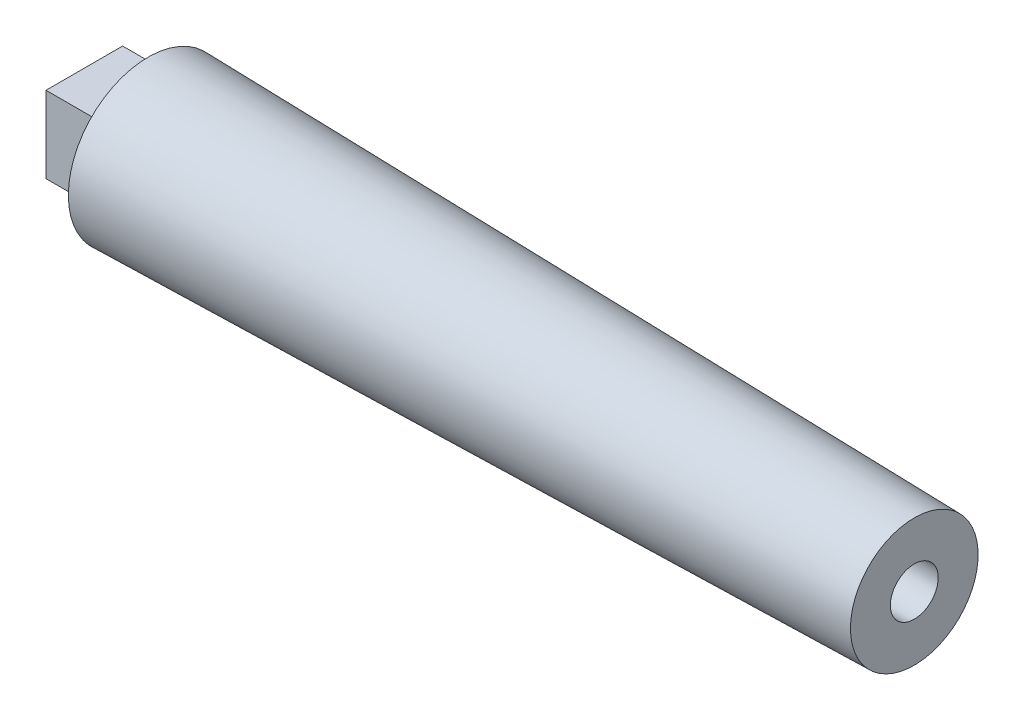
ISO-10303-21;
HEADER;
FILE_DESCRIPTION(('STEP AP214'),'2;1');
FILE_NAME('part.step','',(''),(''),'','','');
FILE_SCHEMA(('AUTOMOTIVE_DESIGN { 1 0 10303 214 1 1 1 1 }'));
ENDSEC;
DATA;
#1=APPLICATION_CONTEXT('core data for automotive mechanical design processes');
#2=APPLICATION_PROTOCOL_DEFINITION('international standard','automotive_design',2000,#1);
#3=PRODUCT_CONTEXT('',#1,'mechanical');
#4=PRODUCT('Part','Part','',(#3));
#5=PRODUCT_RELATED_PRODUCT_CATEGORY('part','',(#4));
#6=PRODUCT_DEFINITION_FORMATION('','',#4);
#7=PRODUCT_DEFINITION_CONTEXT('part definition',#1,'design');
#8=PRODUCT_DEFINITION('design','',#6,#7);
#9=PRODUCT_DEFINITION_SHAPE('','',#8);
#10=(LENGTH_UNIT() NAMED_UNIT(*) SI_UNIT(.MILLI.,.METRE.));
#11=(NAMED_UNIT(*) PLANE_ANGLE_UNIT() SI_UNIT($,.RADIAN.));
#12=(NAMED_UNIT(*) SI_UNIT($,.STERADIAN.) SOLID_ANGLE_UNIT());
#13=UNCERTAINTY_MEASURE_WITH_UNIT(LENGTH_MEASURE(1.E-05),#10,'distance_accuracy_value','');
#14=(GEOMETRIC_REPRESENTATION_CONTEXT(3) GLOBAL_UNCERTAINTY_ASSIGNED_CONTEXT((#13)) GLOBAL_UNIT_ASSIGNED_CONTEXT((#10,
#11,#12)) REPRESENTATION_CONTEXT('',''));
#15=CARTESIAN_POINT('',(0.,0.,0.));
#16=DIRECTION('',(0.,0.,1.));
#17=DIRECTION('',(1.,0.,0.));
#18=AXIS2_PLACEMENT_3D('',#15,#16,#17);
#19=CARTESIAN_POINT('',(0.,15.875,0.));
#20=DIRECTION('',(1.,0.,0.));
#21=DIRECTION('',(0.,0.,-1.));
#22=AXIS2_PLACEMENT_3D('',#19,#20,#21);
#23=PLANE('',#22);
#24=CARTESIAN_POINT('',(0.,0.,0.));
#25=DIRECTION('',(-1.,0.,0.));
#26=DIRECTION('',(0.,0.,1.));
#27=AXIS2_PLACEMENT_3D('',#24,#25,#26);
#28=CIRCLE('',#27,15.875);
#29=CARTESIAN_POINT('',(0.,0.,15.875));
#30=VERTEX_POINT('',#29);
#31=EDGE_CURVE('E40',#30,#30,#28,.T.);
#32=ORIENTED_EDGE('',*,*,#31,.T.);
#33=EDGE_LOOP('',(#32));
#34=FACE_BOUND('',#33,.T.);
#35=DIRECTION('',(0.,1.,0.));
#36=VECTOR('',#35,1.);
#37=CARTESIAN_POINT('',(0.,7.62,7.62));
#38=LINE('',#37,#36);
#39=CARTESIAN_POINT('',(0.,-7.62,7.62));
#40=VERTEX_POINT('',#39);
#41=CARTESIAN_POINT('',(0.,7.62,7.62));
#42=VERTEX_POINT('',#41);
#43=EDGE_CURVE('E47',#40,#42,#38,.T.);
#44=ORIENTED_EDGE('',*,*,#43,.F.);
#45=DIRECTION('',(0.,0.,1.));
#46=VECTOR('',#45,1.);
#47=CARTESIAN_POINT('',(0.,-7.62,-7.62));
#48=LINE('',#47,#46);
#49=CARTESIAN_POINT('',(0.,-7.62,-7.62));
#50=VERTEX_POINT('',#49);
#51=EDGE_CURVE('E51',#50,#40,#48,.T.);
#52=ORIENTED_EDGE('',*,*,#51,.F.);
#53=DIRECTION('',(0.,-1.,0.));
#54=VECTOR('',#53,1.);
#55=CARTESIAN_POINT('',(0.,7.62,-7.62));
#56=LINE('',#55,#54);
#57=CARTESIAN_POINT('',(0.,7.62,-7.62));
#58=VERTEX_POINT('',#57);
#59=EDGE_CURVE('E203',#58,#50,#56,.T.);
#60=ORIENTED_EDGE('',*,*,#59,.F.);
#61=DIRECTION('',(0.,0.,-1.));
#62=VECTOR('',#61,1.);
#63=CARTESIAN_POINT('',(0.,7.62,-7.62));
#64=LINE('',#63,#62);
#65=EDGE_CURVE('E209',#42,#58,#64,.T.);
#66=ORIENTED_EDGE('',*,*,#65,.F.);
#67=EDGE_LOOP('',(#44,#52,#60,#66));
#68=FACE_BOUND('',#67,.T.);
#69=ADVANCED_FACE('F33',(#34,#68),#23,.F.);
#70=CARTESIAN_POINT('',(152.4,0.,0.));
#71=DIRECTION('',(-1.,0.,0.));
#72=DIRECTION('',(0.,0.,1.));
#73=AXIS2_PLACEMENT_3D('',#70,#71,#72);
#74=PLANE('',#73);
#75=CARTESIAN_POINT('',(152.4,0.,0.));
#76=DIRECTION('',(1.,0.,0.));
#77=DIRECTION('',(0.,0.,-1.));
#78=AXIS2_PLACEMENT_3D('',#75,#76,#77);
#79=CIRCLE('',#78,4.7625);
#80=CARTESIAN_POINT('',(152.4,0.,-4.7625));
#81=VERTEX_POINT('',#80);
#82=EDGE_CURVE('E93',#81,#81,#79,.T.);
#83=ORIENTED_EDGE('',*,*,#82,.F.);
#84=EDGE_LOOP('',(#83));
#85=FACE_BOUND('',#84,.T.);
#86=CARTESIAN_POINT('',(152.4,0.,0.));
#87=DIRECTION('',(-1.,0.,0.));
#88=DIRECTION('',(0.,0.,1.));
#89=AXIS2_PLACEMENT_3D('',#86,#87,#88);
#90=CIRCLE('',#89,12.7);
#91=CARTESIAN_POINT('',(152.4,0.,12.7));
#92=VERTEX_POINT('',#91);
#93=EDGE_CURVE('E11',#92,#92,#90,.T.);
#94=ORIENTED_EDGE('',*,*,#93,.F.);
#95=EDGE_LOOP('',(#94));
#96=FACE_BOUND('',#95,.T.);
#97=ADVANCED_FACE('F111',(#85,#96),#74,.F.);
#98=CARTESIAN_POINT('',(152.4,0.,0.));
#99=DIRECTION('',(-1.,0.,0.));
#100=DIRECTION('',(0.,0.,1.));
#101=AXIS2_PLACEMENT_3D('',#98,#99,#100);
#102=CONICAL_SURFACE('',#101,12.7,0.0208303200362171);
#103=ORIENTED_EDGE('',*,*,#31,.F.);
#104=EDGE_LOOP('',(#103));
#105=FACE_BOUND('',#104,.T.);
#106=ORIENTED_EDGE('',*,*,#93,.T.);
#107=EDGE_LOOP('',(#106));
#108=FACE_BOUND('',#107,.T.);
#109=ADVANCED_FACE('F107',(#105,#108),#102,.T.);
#110=CARTESIAN_POINT('',(127.,0.,0.));
#111=DIRECTION('',(1.,0.,0.));
#112=DIRECTION('',(0.,0.,-1.));
#113=AXIS2_PLACEMENT_3D('',#110,#111,#112);
#114=CYLINDRICAL_SURFACE('',#113,4.7625);
#115=CARTESIAN_POINT('',(127.,0.,0.));
#116=DIRECTION('',(1.,0.,0.));
#117=DIRECTION('',(0.,0.,-1.));
#118=AXIS2_PLACEMENT_3D('',#115,#116,#117);
#119=CIRCLE('',#118,4.7625);
#120=CARTESIAN_POINT('',(127.,0.,-4.7625));
#121=VERTEX_POINT('',#120);
#122=EDGE_CURVE('E96',#121,#121,#119,.T.);
#123=ORIENTED_EDGE('',*,*,#122,.F.);
#124=EDGE_LOOP('',(#123));
#125=FACE_BOUND('',#124,.T.);
#126=ORIENTED_EDGE('',*,*,#82,.T.);
#127=EDGE_LOOP('',(#126));
#128=FACE_BOUND('',#127,.T.);
#129=ADVANCED_FACE('F110',(#125,#128),#114,.F.);
#130=CARTESIAN_POINT('',(127.,0.,0.));
#131=DIRECTION('',(1.,0.,0.));
#132=DIRECTION('',(0.,0.,-1.));
#133=AXIS2_PLACEMENT_3D('',#130,#131,#132);
#134=PLANE('',#133);
#135=ORIENTED_EDGE('',*,*,#122,.T.);
#136=EDGE_LOOP('',(#135));
#137=FACE_BOUND('',#136,.T.);
#138=ADVANCED_FACE('F124',(#137),#134,.T.);
#139=CARTESIAN_POINT('',(-12.7,7.62,7.62));
#140=DIRECTION('',(0.,0.,-1.));
#141=DIRECTION('',(0.,1.,0.));
#142=AXIS2_PLACEMENT_3D('',#139,#140,#141);
#143=PLANE('',#142);
#144=ORIENTED_EDGE('',*,*,#43,.T.);
#145=DIRECTION('',(1.,0.,0.));
#146=VECTOR('',#145,1.);
#147=CARTESIAN_POINT('',(-12.7,7.62,7.62));
#148=LINE('',#147,#146);
#149=CARTESIAN_POINT('',(-12.7,7.62,7.62));
#150=VERTEX_POINT('',#149);
#151=EDGE_CURVE('E76',#150,#42,#148,.T.);
#152=ORIENTED_EDGE('',*,*,#151,.F.);
#153=DIRECTION('',(0.,1.,0.));
#154=VECTOR('',#153,1.);
#155=CARTESIAN_POINT('',(-12.7,7.62,7.62));
#156=LINE('',#155,#154);
#157=CARTESIAN_POINT('',(-12.7,-7.62,7.62));
#158=VERTEX_POINT('',#157);
#159=EDGE_CURVE('E82',#158,#150,#156,.T.);
#160=ORIENTED_EDGE('',*,*,#159,.F.);
#161=DIRECTION('',(1.,0.,0.));
#162=VECTOR('',#161,1.);
#163=CARTESIAN_POINT('',(-12.7,-7.62,7.62));
#164=LINE('',#163,#162);
#165=EDGE_CURVE('E201',#158,#40,#164,.T.);
#166=ORIENTED_EDGE('',*,*,#165,.T.);
#167=EDGE_LOOP('',(#144,#152,#160,#166));
#168=FACE_BOUND('',#167,.T.);
#169=ADVANCED_FACE('F92',(#168),#143,.F.);
#170=CARTESIAN_POINT('',(-12.7,7.62,-7.62));
#171=DIRECTION('',(0.,-1.,0.));
#172=DIRECTION('',(0.,0.,-1.));
#173=AXIS2_PLACEMENT_3D('',#170,#171,#172);
#174=PLANE('',#173);
#175=ORIENTED_EDGE('',*,*,#65,.T.);
#176=DIRECTION('',(1.,0.,0.));
#177=VECTOR('',#176,1.);
#178=CARTESIAN_POINT('',(-12.7,7.62,-7.62));
#179=LINE('',#178,#177);
#180=CARTESIAN_POINT('',(-12.7,7.62,-7.62));
#181=VERTEX_POINT('',#180);
#182=EDGE_CURVE('E78',#181,#58,#179,.T.);
#183=ORIENTED_EDGE('',*,*,#182,.F.);
#184=DIRECTION('',(0.,0.,-1.));
#185=VECTOR('',#184,1.);
#186=CARTESIAN_POINT('',(-12.7,7.62,-7.62));
#187=LINE('',#186,#185);
#188=EDGE_CURVE('E71',#150,#181,#187,.T.);
#189=ORIENTED_EDGE('',*,*,#188,.F.);
#190=ORIENTED_EDGE('',*,*,#151,.T.);
#191=EDGE_LOOP('',(#175,#183,#189,#190));
#192=FACE_BOUND('',#191,.T.);
#193=ADVANCED_FACE('F74',(#192),#174,.F.);
#194=CARTESIAN_POINT('',(-12.7,7.62,-7.62));
#195=DIRECTION('',(0.,0.,1.));
#196=DIRECTION('',(0.,-1.,0.));
#197=AXIS2_PLACEMENT_3D('',#194,#195,#196);
#198=PLANE('',#197);
#199=ORIENTED_EDGE('',*,*,#59,.T.);
#200=DIRECTION('',(1.,0.,0.));
#201=VECTOR('',#200,1.);
#202=CARTESIAN_POINT('',(-12.7,-7.62,-7.62));
#203=LINE('',#202,#201);
#204=CARTESIAN_POINT('',(-12.7,-7.62,-7.62));
#205=VERTEX_POINT('',#204);
#206=EDGE_CURVE('E98',#205,#50,#203,.T.);
#207=ORIENTED_EDGE('',*,*,#206,.F.);
#208=DIRECTION('',(0.,-1.,0.));
#209=VECTOR('',#208,1.);
#210=CARTESIAN_POINT('',(-12.7,7.62,-7.62));
#211=LINE('',#210,#209);
#212=EDGE_CURVE('E81',#181,#205,#211,.T.);
#213=ORIENTED_EDGE('',*,*,#212,.F.);
#214=ORIENTED_EDGE('',*,*,#182,.T.);
#215=EDGE_LOOP('',(#199,#207,#213,#214));
#216=FACE_BOUND('',#215,.T.);
#217=ADVANCED_FACE('F133',(#216),#198,.F.);
#218=CARTESIAN_POINT('',(-12.7,-7.62,-7.62));
#219=DIRECTION('',(0.,1.,0.));
#220=DIRECTION('',(0.,0.,1.));
#221=AXIS2_PLACEMENT_3D('',#218,#219,#220);
#222=PLANE('',#221);
#223=ORIENTED_EDGE('',*,*,#51,.T.);
#224=ORIENTED_EDGE('',*,*,#165,.F.);
#225=DIRECTION('',(0.,0.,1.));
#226=VECTOR('',#225,1.);
#227=CARTESIAN_POINT('',(-12.7,-7.62,-7.62));
#228=LINE('',#227,#226);
#229=EDGE_CURVE('E87',#205,#158,#228,.T.);
#230=ORIENTED_EDGE('',*,*,#229,.F.);
#231=ORIENTED_EDGE('',*,*,#206,.T.);
#232=EDGE_LOOP('',(#223,#224,#230,#231));
#233=FACE_BOUND('',#232,.T.);
#234=ADVANCED_FACE('F136',(#233),#222,.F.);
#235=CARTESIAN_POINT('',(-12.7,0.,0.));
#236=DIRECTION('',(-1.,0.,0.));
#237=DIRECTION('',(0.,0.,1.));
#238=AXIS2_PLACEMENT_3D('',#235,#236,#237);
#239=PLANE('',#238);
#240=ORIENTED_EDGE('',*,*,#159,.T.);
#241=ORIENTED_EDGE('',*,*,#188,.T.);
#242=ORIENTED_EDGE('',*,*,#212,.T.);
#243=ORIENTED_EDGE('',*,*,#229,.T.);
#244=EDGE_LOOP('',(#240,#241,#242,#243));
#245=FACE_BOUND('',#244,.T.);
#246=ADVANCED_FACE('F85',(#245),#239,.T.);
#247=CLOSED_SHELL('',(#69,#97,#109,#129,#138,#169,#193,#217,#234,#246));
#248=MANIFOLD_SOLID_BREP('B2',#247);
#249=ADVANCED_BREP_SHAPE_REPRESENTATION('',(#18,#248),#14);
#250=SHAPE_DEFINITION_REPRESENTATION(#9,#249);
ENDSEC;
END-ISO-10303-21;
